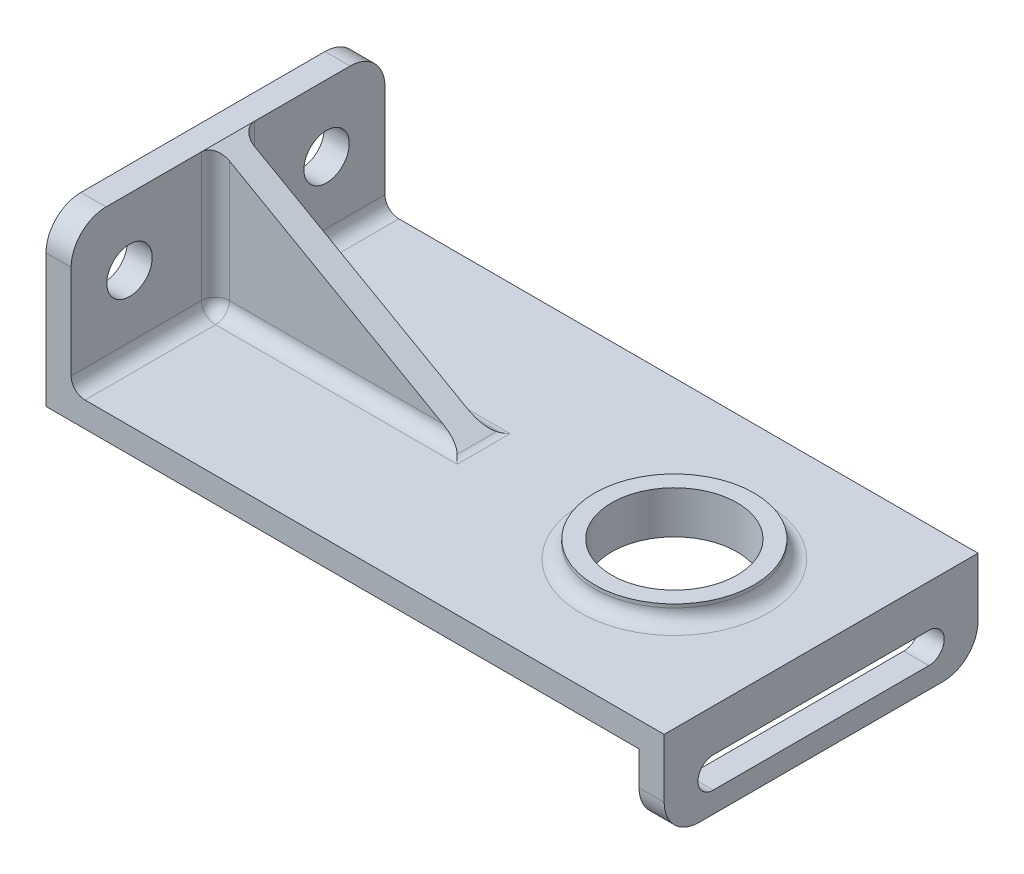
ISO-10303-21;
HEADER;
FILE_DESCRIPTION(('STEP AP214'),'2;1');
FILE_NAME('part.step','',(''),(''),'','','');
FILE_SCHEMA(('AUTOMOTIVE_DESIGN { 1 0 10303 214 1 1 1 1 }'));
ENDSEC;
DATA;
#1=APPLICATION_CONTEXT('core data for automotive mechanical design processes');
#2=APPLICATION_PROTOCOL_DEFINITION('international standard','automotive_design',2000,#1);
#3=PRODUCT_CONTEXT('',#1,'mechanical');
#4=PRODUCT('Part','Part','',(#3));
#5=PRODUCT_RELATED_PRODUCT_CATEGORY('part','',(#4));
#6=PRODUCT_DEFINITION_FORMATION('','',#4);
#7=PRODUCT_DEFINITION_CONTEXT('part definition',#1,'design');
#8=PRODUCT_DEFINITION('design','',#6,#7);
#9=PRODUCT_DEFINITION_SHAPE('','',#8);
#10=(LENGTH_UNIT() NAMED_UNIT(*) SI_UNIT(.MILLI.,.METRE.));
#11=(NAMED_UNIT(*) PLANE_ANGLE_UNIT() SI_UNIT($,.RADIAN.));
#12=(NAMED_UNIT(*) SI_UNIT($,.STERADIAN.) SOLID_ANGLE_UNIT());
#13=UNCERTAINTY_MEASURE_WITH_UNIT(LENGTH_MEASURE(1.E-05),#10,'distance_accuracy_value','');
#14=(GEOMETRIC_REPRESENTATION_CONTEXT(3) GLOBAL_UNCERTAINTY_ASSIGNED_CONTEXT((#13)) GLOBAL_UNIT_ASSIGNED_CONTEXT((#10,
#11,#12)) REPRESENTATION_CONTEXT('',''));
#15=CARTESIAN_POINT('',(0.,0.,0.));
#16=DIRECTION('',(0.,0.,1.));
#17=DIRECTION('',(1.,0.,0.));
#18=AXIS2_PLACEMENT_3D('',#15,#16,#17);
#19=CARTESIAN_POINT('',(4.572,30.5769704433498,57.15));
#20=DIRECTION('',(-1.,0.,0.));
#21=DIRECTION('',(0.,0.,1.));
#22=AXIS2_PLACEMENT_3D('',#19,#20,#21);
#23=PLANE('',#22);
#24=CARTESIAN_POINT('',(4.572,18.4320182001585,10.6369174101885));
#25=DIRECTION('',(1.,0.,0.));
#26=DIRECTION('',(0.,0.,1.));
#27=AXIS2_PLACEMENT_3D('',#24,#25,#26);
#28=CIRCLE('',#27,4.13408051592562);
#29=CARTESIAN_POINT('',(4.572,18.4320182001585,14.7709979261142));
#30=VERTEX_POINT('',#29);
#31=EDGE_CURVE('E556',#30,#30,#28,.T.);
#32=ORIENTED_EDGE('',*,*,#31,.F.);
#33=EDGE_LOOP('',(#32));
#34=FACE_BOUND('',#33,.T.);
#35=DIRECTION('',(0.,1.,0.));
#36=VECTOR('',#35,1.);
#37=CARTESIAN_POINT('',(4.572,30.5769704433498,0.));
#38=LINE('',#37,#36);
#39=CARTESIAN_POINT('',(4.572,7.112,0.));
#40=VERTEX_POINT('',#39);
#41=CARTESIAN_POINT('',(4.572,24.2269704433498,0.));
#42=VERTEX_POINT('',#41);
#43=EDGE_CURVE('E260',#40,#42,#38,.T.);
#44=ORIENTED_EDGE('',*,*,#43,.T.);
#45=CARTESIAN_POINT('',(4.572,24.2269704433498,6.35));
#46=DIRECTION('',(-1.,0.,0.));
#47=DIRECTION('',(0.,0.,1.));
#48=AXIS2_PLACEMENT_3D('',#45,#46,#47);
#49=CIRCLE('',#48,6.35);
#50=CARTESIAN_POINT('',(4.572,30.5769704433498,6.35));
#51=VERTEX_POINT('',#50);
#52=EDGE_CURVE('E39',#42,#51,#49,.F.);
#53=ORIENTED_EDGE('',*,*,#52,.T.);
#54=DIRECTION('',(0.,0.,-1.));
#55=VECTOR('',#54,1.);
#56=CARTESIAN_POINT('',(4.572,30.5769704433498,57.15));
#57=LINE('',#56,#55);
#58=CARTESIAN_POINT('',(4.572,30.5769704433498,23.749));
#59=VERTEX_POINT('',#58);
#60=EDGE_CURVE('E273',#59,#51,#57,.T.);
#61=ORIENTED_EDGE('',*,*,#60,.F.);
#62=DIRECTION('',(0.,-1.,0.));
#63=VECTOR('',#62,1.);
#64=CARTESIAN_POINT('',(4.572,4.572,23.749));
#65=LINE('',#64,#63);
#66=CARTESIAN_POINT('',(4.572,7.112,23.749));
#67=VERTEX_POINT('',#66);
#68=EDGE_CURVE('E313',#59,#67,#65,.T.);
#69=ORIENTED_EDGE('',*,*,#68,.T.);
#70=DIRECTION('',(0.,0.,-1.));
#71=VECTOR('',#70,1.);
#72=CARTESIAN_POINT('',(4.572,7.112,0.));
#73=LINE('',#72,#71);
#74=EDGE_CURVE('E315',#67,#40,#73,.T.);
#75=ORIENTED_EDGE('',*,*,#74,.T.);
#76=EDGE_LOOP('',(#44,#53,#61,#69,#75));
#77=FACE_BOUND('',#76,.T.);
#78=ADVANCED_FACE('F31',(#34,#77),#23,.F.);
#79=CARTESIAN_POINT('',(4.572,4.572,57.15));
#80=DIRECTION('',(0.,-1.,0.));
#81=DIRECTION('',(0.,0.,-1.));
#82=AXIS2_PLACEMENT_3D('',#79,#80,#81);
#83=PLANE('',#82);
#84=DIRECTION('',(-1.,0.,0.));
#85=VECTOR('',#84,1.);
#86=CARTESIAN_POINT('',(4.572,4.572,0.));
#87=LINE('',#86,#85);
#88=CARTESIAN_POINT('',(112.562032379476,4.572,0.));
#89=VERTEX_POINT('',#88);
#90=CARTESIAN_POINT('',(7.112,4.572,0.));
#91=VERTEX_POINT('',#90);
#92=EDGE_CURVE('E282',#89,#91,#87,.T.);
#93=ORIENTED_EDGE('',*,*,#92,.T.);
#94=DIRECTION('',(0.,0.,-1.));
#95=VECTOR('',#94,1.);
#96=CARTESIAN_POINT('',(7.112,4.572,26.289));
#97=LINE('',#96,#95);
#98=CARTESIAN_POINT('',(7.112,4.572,23.749));
#99=VERTEX_POINT('',#98);
#100=EDGE_CURVE('E326',#91,#99,#97,.F.);
#101=ORIENTED_EDGE('',*,*,#100,.T.);
#102=DIRECTION('',(1.,0.,0.));
#103=VECTOR('',#102,1.);
#104=CARTESIAN_POINT('',(50.4513053062079,4.572,23.749));
#105=LINE('',#104,#103);
#106=CARTESIAN_POINT('',(51.1211008800022,4.572,23.749));
#107=VERTEX_POINT('',#106);
#108=EDGE_CURVE('E322',#99,#107,#105,.T.);
#109=ORIENTED_EDGE('',*,*,#108,.T.);
#110=DIRECTION('',(0.,0.,-1.));
#111=VECTOR('',#110,1.);
#112=CARTESIAN_POINT('',(51.1211008800022,4.572,30.861));
#113=LINE('',#112,#111);
#114=CARTESIAN_POINT('',(51.1211008800022,4.572,33.401));
#115=VERTEX_POINT('',#114);
#116=EDGE_CURVE('E320',#107,#115,#113,.F.);
#117=ORIENTED_EDGE('',*,*,#116,.T.);
#118=DIRECTION('',(1.,0.,0.));
#119=VECTOR('',#118,1.);
#120=CARTESIAN_POINT('',(4.572,4.572,33.401));
#121=LINE('',#120,#119);
#122=CARTESIAN_POINT('',(7.112,4.572,33.401));
#123=VERTEX_POINT('',#122);
#124=EDGE_CURVE('E318',#115,#123,#121,.F.);
#125=ORIENTED_EDGE('',*,*,#124,.T.);
#126=DIRECTION('',(0.,0.,-1.));
#127=VECTOR('',#126,1.);
#128=CARTESIAN_POINT('',(7.112,4.572,57.15));
#129=LINE('',#128,#127);
#130=CARTESIAN_POINT('',(7.112,4.572,57.15));
#131=VERTEX_POINT('',#130);
#132=EDGE_CURVE('E324',#123,#131,#129,.F.);
#133=ORIENTED_EDGE('',*,*,#132,.T.);
#134=DIRECTION('',(-1.,0.,0.));
#135=VECTOR('',#134,1.);
#136=CARTESIAN_POINT('',(4.572,4.572,57.15));
#137=LINE('',#136,#135);
#138=CARTESIAN_POINT('',(112.562032379476,4.572,57.15));
#139=VERTEX_POINT('',#138);
#140=EDGE_CURVE('E267',#139,#131,#137,.T.);
#141=ORIENTED_EDGE('',*,*,#140,.F.);
#142=DIRECTION('',(0.,0.,-1.));
#143=VECTOR('',#142,1.);
#144=CARTESIAN_POINT('',(112.562032379476,4.572,57.15));
#145=LINE('',#144,#143);
#146=EDGE_CURVE('E289',#139,#89,#145,.T.);
#147=ORIENTED_EDGE('',*,*,#146,.T.);
#148=EDGE_LOOP('',(#93,#101,#109,#117,#125,#133,#141,#147));
#149=FACE_BOUND('',#148,.T.);
#150=CARTESIAN_POINT('',(85.8466273348881,4.572,28.575));
#151=DIRECTION('',(0.,-1.,0.));
#152=DIRECTION('',(0.,0.,-1.));
#153=AXIS2_PLACEMENT_3D('',#150,#151,#152);
#154=CIRCLE('',#153,17.0464140193085);
#155=CARTESIAN_POINT('',(85.8466273348881,4.572,11.5285859806915));
#156=VERTEX_POINT('',#155);
#157=EDGE_CURVE('E310',#156,#156,#154,.T.);
#158=ORIENTED_EDGE('',*,*,#157,.T.);
#159=EDGE_LOOP('',(#158));
#160=FACE_BOUND('',#159,.T.);
#161=ADVANCED_FACE('F460',(#149,#160),#83,.F.);
#162=CARTESIAN_POINT('',(0.,30.5769704433498,57.15));
#163=DIRECTION('',(0.,-1.,0.));
#164=DIRECTION('',(0.,0.,-1.));
#165=AXIS2_PLACEMENT_3D('',#162,#163,#164);
#166=PLANE('',#165);
#167=ORIENTED_EDGE('',*,*,#60,.T.);
#168=DIRECTION('',(-1.,0.,0.));
#169=VECTOR('',#168,1.);
#170=CARTESIAN_POINT('',(0.,30.5769704433498,6.35));
#171=LINE('',#170,#169);
#172=CARTESIAN_POINT('',(0.,30.5769704433498,6.35));
#173=VERTEX_POINT('',#172);
#174=EDGE_CURVE('E404',#51,#173,#171,.T.);
#175=ORIENTED_EDGE('',*,*,#174,.T.);
#176=DIRECTION('',(0.,0.,-1.));
#177=VECTOR('',#176,1.);
#178=CARTESIAN_POINT('',(0.,30.5769704433498,57.15));
#179=LINE('',#178,#177);
#180=CARTESIAN_POINT('',(0.,30.5769704433498,50.8));
#181=VERTEX_POINT('',#180);
#182=EDGE_CURVE('E304',#181,#173,#179,.T.);
#183=ORIENTED_EDGE('',*,*,#182,.F.);
#184=DIRECTION('',(-1.,0.,0.));
#185=VECTOR('',#184,1.);
#186=CARTESIAN_POINT('',(0.,30.5769704433498,50.8));
#187=LINE('',#186,#185);
#188=CARTESIAN_POINT('',(4.572,30.5769704433498,50.8));
#189=VERTEX_POINT('',#188);
#190=EDGE_CURVE('E402',#181,#189,#187,.F.);
#191=ORIENTED_EDGE('',*,*,#190,.T.);
#192=CARTESIAN_POINT('',(4.572,30.5769704433498,33.401));
#193=VERTEX_POINT('',#192);
#194=EDGE_CURVE('E287',#189,#193,#57,.T.);
#195=ORIENTED_EDGE('',*,*,#194,.T.);
#196=DIRECTION('',(0.,0.,-1.));
#197=VECTOR('',#196,1.);
#198=CARTESIAN_POINT('',(4.572,30.5769704433498,30.861));
#199=LINE('',#198,#197);
#200=EDGE_CURVE('E241',#193,#59,#199,.T.);
#201=ORIENTED_EDGE('',*,*,#200,.T.);
#202=EDGE_LOOP('',(#167,#175,#183,#191,#195,#201));
#203=FACE_BOUND('',#202,.T.);
#204=ADVANCED_FACE('F419',(#203),#166,.F.);
#205=CARTESIAN_POINT('',(0.,30.5769704433498,57.15));
#206=DIRECTION('',(1.,0.,0.));
#207=DIRECTION('',(0.,0.,-1.));
#208=AXIS2_PLACEMENT_3D('',#205,#206,#207);
#209=PLANE('',#208);
#210=CARTESIAN_POINT('',(0.,18.4320182001585,10.6369174101885));
#211=DIRECTION('',(1.,0.,0.));
#212=DIRECTION('',(0.,0.,1.));
#213=AXIS2_PLACEMENT_3D('',#210,#211,#212);
#214=CIRCLE('',#213,4.13408051592562);
#215=CARTESIAN_POINT('',(0.,18.4320182001585,14.7709979261142));
#216=VERTEX_POINT('',#215);
#217=EDGE_CURVE('E553',#216,#216,#214,.T.);
#218=ORIENTED_EDGE('',*,*,#217,.T.);
#219=EDGE_LOOP('',(#218));
#220=FACE_BOUND('',#219,.T.);
#221=CARTESIAN_POINT('',(0.,18.4320182001585,46.5130825898115));
#222=DIRECTION('',(1.,0.,0.));
#223=DIRECTION('',(0.,0.,-1.));
#224=AXIS2_PLACEMENT_3D('',#221,#222,#223);
#225=CIRCLE('',#224,4.13408051592562);
#226=CARTESIAN_POINT('',(0.,18.4320182001585,42.3790020738858));
#227=VERTEX_POINT('',#226);
#228=EDGE_CURVE('E228',#227,#227,#225,.T.);
#229=ORIENTED_EDGE('',*,*,#228,.T.);
#230=EDGE_LOOP('',(#229));
#231=FACE_BOUND('',#230,.T.);
#232=ORIENTED_EDGE('',*,*,#182,.T.);
#233=CARTESIAN_POINT('',(0.,24.2269704433498,6.35));
#234=DIRECTION('',(1.,0.,0.));
#235=DIRECTION('',(0.,0.,-1.));
#236=AXIS2_PLACEMENT_3D('',#233,#234,#235);
#237=CIRCLE('',#236,6.35);
#238=CARTESIAN_POINT('',(0.,24.2269704433498,0.));
#239=VERTEX_POINT('',#238);
#240=EDGE_CURVE('E409',#173,#239,#237,.F.);
#241=ORIENTED_EDGE('',*,*,#240,.T.);
#242=DIRECTION('',(0.,-1.,0.));
#243=VECTOR('',#242,1.);
#244=CARTESIAN_POINT('',(0.,30.5769704433498,0.));
#245=LINE('',#244,#243);
#246=CARTESIAN_POINT('',(0.,0.,0.));
#247=VERTEX_POINT('',#246);
#248=EDGE_CURVE('E256',#239,#247,#245,.T.);
#249=ORIENTED_EDGE('',*,*,#248,.T.);
#250=DIRECTION('',(0.,0.,-1.));
#251=VECTOR('',#250,1.);
#252=CARTESIAN_POINT('',(0.,0.,57.15));
#253=LINE('',#252,#251);
#254=CARTESIAN_POINT('',(0.,0.,57.15));
#255=VERTEX_POINT('',#254);
#256=EDGE_CURVE('E301',#255,#247,#253,.T.);
#257=ORIENTED_EDGE('',*,*,#256,.F.);
#258=DIRECTION('',(0.,-1.,0.));
#259=VECTOR('',#258,1.);
#260=CARTESIAN_POINT('',(0.,30.5769704433498,57.15));
#261=LINE('',#260,#259);
#262=CARTESIAN_POINT('',(0.,24.2269704433498,57.15));
#263=VERTEX_POINT('',#262);
#264=EDGE_CURVE('E257',#263,#255,#261,.T.);
#265=ORIENTED_EDGE('',*,*,#264,.F.);
#266=CARTESIAN_POINT('',(0.,24.2269704433498,50.8));
#267=DIRECTION('',(1.,0.,0.));
#268=DIRECTION('',(0.,0.,-1.));
#269=AXIS2_PLACEMENT_3D('',#266,#267,#268);
#270=CIRCLE('',#269,6.35);
#271=EDGE_CURVE('E407',#263,#181,#270,.F.);
#272=ORIENTED_EDGE('',*,*,#271,.T.);
#273=EDGE_LOOP('',(#232,#241,#249,#257,#265,#272));
#274=FACE_BOUND('',#273,.T.);
#275=ADVANCED_FACE('F425',(#220,#231,#274),#209,.F.);
#276=CARTESIAN_POINT('',(0.,0.,57.15));
#277=DIRECTION('',(0.,1.,0.));
#278=DIRECTION('',(0.,0.,1.));
#279=AXIS2_PLACEMENT_3D('',#276,#277,#278);
#280=PLANE('',#279);
#281=CARTESIAN_POINT('',(85.8466273348881,0.,28.575));
#282=DIRECTION('',(0.,1.,0.));
#283=DIRECTION('',(0.,0.,1.));
#284=AXIS2_PLACEMENT_3D('',#281,#282,#283);
#285=CIRCLE('',#284,11.4214455987884);
#286=CARTESIAN_POINT('',(85.8466273348881,0.,39.9964455987884));
#287=VERTEX_POINT('',#286);
#288=EDGE_CURVE('E250',#287,#287,#285,.T.);
#289=ORIENTED_EDGE('',*,*,#288,.T.);
#290=EDGE_LOOP('',(#289));
#291=FACE_BOUND('',#290,.T.);
#292=DIRECTION('',(1.,0.,0.));
#293=VECTOR('',#292,1.);
#294=CARTESIAN_POINT('',(0.,0.,0.));
#295=LINE('',#294,#293);
#296=CARTESIAN_POINT('',(107.990032379476,0.,0.));
#297=VERTEX_POINT('',#296);
#298=EDGE_CURVE('E275',#247,#297,#295,.T.);
#299=ORIENTED_EDGE('',*,*,#298,.T.);
#300=DIRECTION('',(0.,0.,-1.));
#301=VECTOR('',#300,1.);
#302=CARTESIAN_POINT('',(107.990032379476,0.,57.15));
#303=LINE('',#302,#301);
#304=CARTESIAN_POINT('',(107.990032379476,0.,57.15));
#305=VERTEX_POINT('',#304);
#306=EDGE_CURVE('E298',#305,#297,#303,.T.);
#307=ORIENTED_EDGE('',*,*,#306,.F.);
#308=DIRECTION('',(1.,0.,0.));
#309=VECTOR('',#308,1.);
#310=CARTESIAN_POINT('',(0.,0.,57.15));
#311=LINE('',#310,#309);
#312=EDGE_CURVE('E259',#255,#305,#311,.T.);
#313=ORIENTED_EDGE('',*,*,#312,.F.);
#314=ORIENTED_EDGE('',*,*,#256,.T.);
#315=EDGE_LOOP('',(#299,#307,#313,#314));
#316=FACE_BOUND('',#315,.T.);
#317=ADVANCED_FACE('F434',(#291,#316),#280,.F.);
#318=CARTESIAN_POINT('',(107.990032379476,0.,57.15));
#319=DIRECTION('',(1.,0.,0.));
#320=DIRECTION('',(0.,0.,-1.));
#321=AXIS2_PLACEMENT_3D('',#318,#319,#320);
#322=PLANE('',#321);
#323=DIRECTION('',(0.,0.,1.));
#324=VECTOR('',#323,1.);
#325=CARTESIAN_POINT('',(107.990032379476,-3.12997114485115,48.2161771103619));
#326=LINE('',#325,#324);
#327=CARTESIAN_POINT('',(107.990032379476,-3.12997114485114,8.93382288963807));
#328=VERTEX_POINT('',#327);
#329=CARTESIAN_POINT('',(107.990032379476,-3.12997114485115,48.2161771103619));
#330=VERTEX_POINT('',#329);
#331=EDGE_CURVE('E205',#328,#330,#326,.T.);
#332=ORIENTED_EDGE('',*,*,#331,.T.);
#333=CARTESIAN_POINT('',(107.990032379476,-5.90657363611414,48.2161771103619));
#334=DIRECTION('',(1.,0.,0.));
#335=DIRECTION('',(0.,0.,-1.));
#336=AXIS2_PLACEMENT_3D('',#333,#334,#335);
#337=CIRCLE('',#336,2.77660249126299);
#338=CARTESIAN_POINT('',(107.990032379476,-8.68317612737713,48.2161771103619));
#339=VERTEX_POINT('',#338);
#340=EDGE_CURVE('E199',#330,#339,#337,.T.);
#341=ORIENTED_EDGE('',*,*,#340,.T.);
#342=DIRECTION('',(0.,0.,-1.));
#343=VECTOR('',#342,1.);
#344=CARTESIAN_POINT('',(107.990032379476,-8.68317612737713,48.2161771103619));
#345=LINE('',#344,#343);
#346=CARTESIAN_POINT('',(107.990032379476,-8.68317612737712,8.93382288963807));
#347=VERTEX_POINT('',#346);
#348=EDGE_CURVE('E208',#339,#347,#345,.T.);
#349=ORIENTED_EDGE('',*,*,#348,.T.);
#350=CARTESIAN_POINT('',(107.990032379476,-5.90657363611413,8.93382288963807));
#351=DIRECTION('',(1.,0.,0.));
#352=DIRECTION('',(0.,0.,-1.));
#353=AXIS2_PLACEMENT_3D('',#350,#351,#352);
#354=CIRCLE('',#353,2.77660249126299);
#355=EDGE_CURVE('E46',#347,#328,#354,.T.);
#356=ORIENTED_EDGE('',*,*,#355,.T.);
#357=EDGE_LOOP('',(#332,#341,#349,#356));
#358=FACE_BOUND('',#357,.T.);
#359=DIRECTION('',(0.,-1.,0.));
#360=VECTOR('',#359,1.);
#361=CARTESIAN_POINT('',(107.990032379476,0.,0.));
#362=LINE('',#361,#360);
#363=CARTESIAN_POINT('',(107.990032379476,-6.14667487684729,0.));
#364=VERTEX_POINT('',#363);
#365=EDGE_CURVE('E277',#297,#364,#362,.T.);
#366=ORIENTED_EDGE('',*,*,#365,.T.);
#367=CARTESIAN_POINT('',(107.990032379476,-6.14667487684729,6.35));
#368=DIRECTION('',(1.,0.,0.));
#369=DIRECTION('',(0.,0.,-1.));
#370=AXIS2_PLACEMENT_3D('',#367,#368,#369);
#371=CIRCLE('',#370,6.35);
#372=CARTESIAN_POINT('',(107.990032379476,-12.4966748768473,6.35));
#373=VERTEX_POINT('',#372);
#374=EDGE_CURVE('E394',#364,#373,#371,.F.);
#375=ORIENTED_EDGE('',*,*,#374,.T.);
#376=DIRECTION('',(0.,0.,-1.));
#377=VECTOR('',#376,1.);
#378=CARTESIAN_POINT('',(107.990032379476,-12.4966748768473,57.15));
#379=LINE('',#378,#377);
#380=CARTESIAN_POINT('',(107.990032379476,-12.4966748768473,50.8));
#381=VERTEX_POINT('',#380);
#382=EDGE_CURVE('E295',#381,#373,#379,.T.);
#383=ORIENTED_EDGE('',*,*,#382,.F.);
#384=CARTESIAN_POINT('',(107.990032379476,-6.14667487684729,50.8));
#385=DIRECTION('',(1.,0.,0.));
#386=DIRECTION('',(0.,0.,-1.));
#387=AXIS2_PLACEMENT_3D('',#384,#385,#386);
#388=CIRCLE('',#387,6.35);
#389=CARTESIAN_POINT('',(107.990032379476,-6.14667487684729,57.15));
#390=VERTEX_POINT('',#389);
#391=EDGE_CURVE('E392',#381,#390,#388,.F.);
#392=ORIENTED_EDGE('',*,*,#391,.T.);
#393=DIRECTION('',(0.,-1.,0.));
#394=VECTOR('',#393,1.);
#395=CARTESIAN_POINT('',(107.990032379476,0.,57.15));
#396=LINE('',#395,#394);
#397=EDGE_CURVE('E262',#305,#390,#396,.T.);
#398=ORIENTED_EDGE('',*,*,#397,.F.);
#399=ORIENTED_EDGE('',*,*,#306,.T.);
#400=EDGE_LOOP('',(#366,#375,#383,#392,#398,#399));
#401=FACE_BOUND('',#400,.T.);
#402=ADVANCED_FACE('F212',(#358,#401),#322,.F.);
#403=CARTESIAN_POINT('',(107.990032379476,-12.4966748768473,57.15));
#404=DIRECTION('',(0.,1.,0.));
#405=DIRECTION('',(0.,0.,1.));
#406=AXIS2_PLACEMENT_3D('',#403,#404,#405);
#407=PLANE('',#406);
#408=ORIENTED_EDGE('',*,*,#382,.T.);
#409=DIRECTION('',(1.,0.,0.));
#410=VECTOR('',#409,1.);
#411=CARTESIAN_POINT('',(112.562032379476,-12.4966748768473,6.35));
#412=LINE('',#411,#410);
#413=CARTESIAN_POINT('',(112.562032379476,-12.4966748768473,6.35));
#414=VERTEX_POINT('',#413);
#415=EDGE_CURVE('E381',#373,#414,#412,.T.);
#416=ORIENTED_EDGE('',*,*,#415,.T.);
#417=DIRECTION('',(0.,0.,-1.));
#418=VECTOR('',#417,1.);
#419=CARTESIAN_POINT('',(112.562032379476,-12.4966748768473,57.15));
#420=LINE('',#419,#418);
#421=CARTESIAN_POINT('',(112.562032379476,-12.4966748768473,50.8));
#422=VERTEX_POINT('',#421);
#423=EDGE_CURVE('E292',#422,#414,#420,.T.);
#424=ORIENTED_EDGE('',*,*,#423,.F.);
#425=DIRECTION('',(1.,0.,0.));
#426=VECTOR('',#425,1.);
#427=CARTESIAN_POINT('',(107.990032379476,-12.4966748768473,50.8));
#428=LINE('',#427,#426);
#429=EDGE_CURVE('E357',#422,#381,#428,.F.);
#430=ORIENTED_EDGE('',*,*,#429,.T.);
#431=EDGE_LOOP('',(#408,#416,#424,#430));
#432=FACE_BOUND('',#431,.T.);
#433=ADVANCED_FACE('F452',(#432),#407,.F.);
#434=CARTESIAN_POINT('',(112.562032379476,4.572,57.15));
#435=DIRECTION('',(-1.,0.,0.));
#436=DIRECTION('',(0.,0.,1.));
#437=AXIS2_PLACEMENT_3D('',#434,#435,#436);
#438=PLANE('',#437);
#439=DIRECTION('',(0.,0.,-1.));
#440=VECTOR('',#439,1.);
#441=CARTESIAN_POINT('',(112.562032379476,-8.68317612737713,48.2161771103619));
#442=LINE('',#441,#440);
#443=CARTESIAN_POINT('',(112.562032379476,-8.68317612737713,48.2161771103619));
#444=VERTEX_POINT('',#443);
#445=CARTESIAN_POINT('',(112.562032379476,-8.68317612737712,8.93382288963807));
#446=VERTEX_POINT('',#445);
#447=EDGE_CURVE('E227',#444,#446,#442,.T.);
#448=ORIENTED_EDGE('',*,*,#447,.F.);
#449=CARTESIAN_POINT('',(112.562032379476,-5.90657363611414,48.2161771103619));
#450=DIRECTION('',(1.,0.,0.));
#451=DIRECTION('',(0.,0.,-1.));
#452=AXIS2_PLACEMENT_3D('',#449,#450,#451);
#453=CIRCLE('',#452,2.77660249126299);
#454=CARTESIAN_POINT('',(112.562032379476,-3.12997114485115,48.2161771103619));
#455=VERTEX_POINT('',#454);
#456=EDGE_CURVE('E54',#455,#444,#453,.T.);
#457=ORIENTED_EDGE('',*,*,#456,.F.);
#458=DIRECTION('',(0.,0.,1.));
#459=VECTOR('',#458,1.);
#460=CARTESIAN_POINT('',(112.562032379476,-3.12997114485115,48.2161771103619));
#461=LINE('',#460,#459);
#462=CARTESIAN_POINT('',(112.562032379476,-3.12997114485114,8.93382288963807));
#463=VERTEX_POINT('',#462);
#464=EDGE_CURVE('E215',#463,#455,#461,.T.);
#465=ORIENTED_EDGE('',*,*,#464,.F.);
#466=CARTESIAN_POINT('',(112.562032379476,-5.90657363611413,8.93382288963807));
#467=DIRECTION('',(1.,0.,0.));
#468=DIRECTION('',(0.,0.,-1.));
#469=AXIS2_PLACEMENT_3D('',#466,#467,#468);
#470=CIRCLE('',#469,2.77660249126299);
#471=EDGE_CURVE('E218',#446,#463,#470,.T.);
#472=ORIENTED_EDGE('',*,*,#471,.F.);
#473=EDGE_LOOP('',(#448,#457,#465,#472));
#474=FACE_BOUND('',#473,.T.);
#475=ORIENTED_EDGE('',*,*,#423,.T.);
#476=CARTESIAN_POINT('',(112.562032379476,-6.14667487684729,6.35));
#477=DIRECTION('',(-1.,0.,0.));
#478=DIRECTION('',(0.,0.,1.));
#479=AXIS2_PLACEMENT_3D('',#476,#477,#478);
#480=CIRCLE('',#479,6.35);
#481=CARTESIAN_POINT('',(112.562032379476,-6.14667487684729,0.));
#482=VERTEX_POINT('',#481);
#483=EDGE_CURVE('E386',#414,#482,#480,.F.);
#484=ORIENTED_EDGE('',*,*,#483,.T.);
#485=DIRECTION('',(0.,1.,0.));
#486=VECTOR('',#485,1.);
#487=CARTESIAN_POINT('',(112.562032379476,4.572,0.));
#488=LINE('',#487,#486);
#489=EDGE_CURVE('E280',#482,#89,#488,.T.);
#490=ORIENTED_EDGE('',*,*,#489,.T.);
#491=ORIENTED_EDGE('',*,*,#146,.F.);
#492=DIRECTION('',(0.,1.,0.));
#493=VECTOR('',#492,1.);
#494=CARTESIAN_POINT('',(112.562032379476,4.572,57.15));
#495=LINE('',#494,#493);
#496=CARTESIAN_POINT('',(112.562032379476,-6.14667487684728,57.15));
#497=VERTEX_POINT('',#496);
#498=EDGE_CURVE('E265',#497,#139,#495,.T.);
#499=ORIENTED_EDGE('',*,*,#498,.F.);
#500=CARTESIAN_POINT('',(112.562032379476,-6.14667487684729,50.8));
#501=DIRECTION('',(-1.,0.,0.));
#502=DIRECTION('',(0.,0.,1.));
#503=AXIS2_PLACEMENT_3D('',#500,#501,#502);
#504=CIRCLE('',#503,6.35);
#505=EDGE_CURVE('E384',#497,#422,#504,.F.);
#506=ORIENTED_EDGE('',*,*,#505,.T.);
#507=EDGE_LOOP('',(#475,#484,#490,#491,#499,#506));
#508=FACE_BOUND('',#507,.T.);
#509=ADVANCED_FACE('F449',(#474,#508),#438,.F.);
#510=CARTESIAN_POINT('',(4.572,18.4320182001585,46.5130825898115));
#511=DIRECTION('',(1.,0.,0.));
#512=DIRECTION('',(0.,0.,-1.));
#513=AXIS2_PLACEMENT_3D('',#510,#511,#512);
#514=CIRCLE('',#513,4.13408051592562);
#515=CARTESIAN_POINT('',(4.572,18.4320182001585,42.3790020738858));
#516=VERTEX_POINT('',#515);
#517=EDGE_CURVE('E221',#516,#516,#514,.T.);
#518=ORIENTED_EDGE('',*,*,#517,.F.);
#519=EDGE_LOOP('',(#518));
#520=FACE_BOUND('',#519,.T.);
#521=ORIENTED_EDGE('',*,*,#194,.F.);
#522=CARTESIAN_POINT('',(4.572,24.2269704433498,50.8));
#523=DIRECTION('',(-1.,0.,0.));
#524=DIRECTION('',(0.,0.,1.));
#525=AXIS2_PLACEMENT_3D('',#522,#523,#524);
#526=CIRCLE('',#525,6.35);
#527=CARTESIAN_POINT('',(4.572,24.2269704433498,57.15));
#528=VERTEX_POINT('',#527);
#529=EDGE_CURVE('E11',#189,#528,#526,.F.);
#530=ORIENTED_EDGE('',*,*,#529,.T.);
#531=DIRECTION('',(0.,1.,0.));
#532=VECTOR('',#531,1.);
#533=CARTESIAN_POINT('',(4.572,30.5769704433498,57.15));
#534=LINE('',#533,#532);
#535=CARTESIAN_POINT('',(4.572,7.112,57.15));
#536=VERTEX_POINT('',#535);
#537=EDGE_CURVE('E270',#536,#528,#534,.T.);
#538=ORIENTED_EDGE('',*,*,#537,.F.);
#539=DIRECTION('',(0.,0.,-1.));
#540=VECTOR('',#539,1.);
#541=CARTESIAN_POINT('',(4.572,7.112,30.861));
#542=LINE('',#541,#540);
#543=CARTESIAN_POINT('',(4.572,7.112,33.401));
#544=VERTEX_POINT('',#543);
#545=EDGE_CURVE('E331',#536,#544,#542,.T.);
#546=ORIENTED_EDGE('',*,*,#545,.T.);
#547=DIRECTION('',(0.,-1.,0.));
#548=VECTOR('',#547,1.);
#549=CARTESIAN_POINT('',(4.572,30.5769704433498,33.401));
#550=LINE('',#549,#548);
#551=EDGE_CURVE('E328',#544,#193,#550,.F.);
#552=ORIENTED_EDGE('',*,*,#551,.T.);
#553=EDGE_LOOP('',(#521,#530,#538,#546,#552));
#554=FACE_BOUND('',#553,.T.);
#555=ADVANCED_FACE('F503',(#520,#554),#23,.F.);
#556=CARTESIAN_POINT('',(4.572,30.5769704433498,57.15));
#557=DIRECTION('',(0.,0.,-1.));
#558=DIRECTION('',(-1.,0.,0.));
#559=AXIS2_PLACEMENT_3D('',#556,#557,#558);
#560=PLANE('',#559);
#561=ORIENTED_EDGE('',*,*,#397,.T.);
#562=DIRECTION('',(1.,0.,0.));
#563=VECTOR('',#562,1.);
#564=CARTESIAN_POINT('',(4.572,-6.14667487684729,57.15));
#565=LINE('',#564,#563);
#566=EDGE_CURVE('E399',#390,#497,#565,.T.);
#567=ORIENTED_EDGE('',*,*,#566,.T.);
#568=ORIENTED_EDGE('',*,*,#498,.T.);
#569=ORIENTED_EDGE('',*,*,#140,.T.);
#570=CARTESIAN_POINT('',(7.112,7.112,57.15));
#571=DIRECTION('',(0.,0.,-1.));
#572=DIRECTION('',(-1.,0.,0.));
#573=AXIS2_PLACEMENT_3D('',#570,#571,#572);
#574=CIRCLE('',#573,2.54);
#575=EDGE_CURVE('E345',#131,#536,#574,.T.);
#576=ORIENTED_EDGE('',*,*,#575,.T.);
#577=ORIENTED_EDGE('',*,*,#537,.T.);
#578=DIRECTION('',(-1.,0.,0.));
#579=VECTOR('',#578,1.);
#580=CARTESIAN_POINT('',(4.572,24.2269704433498,57.15));
#581=LINE('',#580,#579);
#582=EDGE_CURVE('E396',#528,#263,#581,.T.);
#583=ORIENTED_EDGE('',*,*,#582,.T.);
#584=ORIENTED_EDGE('',*,*,#264,.T.);
#585=ORIENTED_EDGE('',*,*,#312,.T.);
#586=EDGE_LOOP('',(#561,#567,#568,#569,#576,#577,#583,#584,#585));
#587=FACE_BOUND('',#586,.T.);
#588=ADVANCED_FACE('F442',(#587),#560,.F.);
#589=CARTESIAN_POINT('',(4.572,30.5769704433498,0.));
#590=DIRECTION('',(0.,0.,-1.));
#591=DIRECTION('',(-1.,0.,0.));
#592=AXIS2_PLACEMENT_3D('',#589,#590,#591);
#593=PLANE('',#592);
#594=ORIENTED_EDGE('',*,*,#489,.F.);
#595=DIRECTION('',(1.,0.,0.));
#596=VECTOR('',#595,1.);
#597=CARTESIAN_POINT('',(107.990032379476,-6.14667487684729,0.));
#598=LINE('',#597,#596);
#599=EDGE_CURVE('E390',#482,#364,#598,.F.);
#600=ORIENTED_EDGE('',*,*,#599,.T.);
#601=ORIENTED_EDGE('',*,*,#365,.F.);
#602=ORIENTED_EDGE('',*,*,#298,.F.);
#603=ORIENTED_EDGE('',*,*,#248,.F.);
#604=DIRECTION('',(-1.,0.,0.));
#605=VECTOR('',#604,1.);
#606=CARTESIAN_POINT('',(4.572,24.2269704433498,0.));
#607=LINE('',#606,#605);
#608=EDGE_CURVE('E388',#239,#42,#607,.F.);
#609=ORIENTED_EDGE('',*,*,#608,.T.);
#610=ORIENTED_EDGE('',*,*,#43,.F.);
#611=CARTESIAN_POINT('',(7.112,7.112,0.));
#612=DIRECTION('',(0.,0.,-1.));
#613=DIRECTION('',(-1.,0.,0.));
#614=AXIS2_PLACEMENT_3D('',#611,#612,#613);
#615=CIRCLE('',#614,2.54);
#616=EDGE_CURVE('E343',#40,#91,#615,.F.);
#617=ORIENTED_EDGE('',*,*,#616,.T.);
#618=ORIENTED_EDGE('',*,*,#92,.F.);
#619=EDGE_LOOP('',(#594,#600,#601,#602,#603,#609,#610,#617,#618));
#620=FACE_BOUND('',#619,.T.);
#621=ADVANCED_FACE('F430',(#620),#593,.T.);
#622=CARTESIAN_POINT('',(85.8466273348881,7.747,28.575));
#623=DIRECTION('',(0.,-1.,0.));
#624=DIRECTION('',(0.,0.,-1.));
#625=AXIS2_PLACEMENT_3D('',#622,#623,#624);
#626=CYLINDRICAL_SURFACE('',#625,14.5064140193085);
#627=CARTESIAN_POINT('',(85.8466273348881,7.112,28.575));
#628=DIRECTION('',(0.,-1.,0.));
#629=DIRECTION('',(0.,0.,-1.));
#630=AXIS2_PLACEMENT_3D('',#627,#628,#629);
#631=CIRCLE('',#630,14.5064140193085);
#632=CARTESIAN_POINT('',(85.8466273348881,7.112,14.0685859806915));
#633=VERTEX_POINT('',#632);
#634=EDGE_CURVE('E307',#633,#633,#631,.F.);
#635=ORIENTED_EDGE('',*,*,#634,.T.);
#636=EDGE_LOOP('',(#635));
#637=FACE_BOUND('',#636,.T.);
#638=CARTESIAN_POINT('',(85.8466273348881,7.747,28.575));
#639=DIRECTION('',(0.,1.,0.));
#640=DIRECTION('',(0.,0.,1.));
#641=AXIS2_PLACEMENT_3D('',#638,#639,#640);
#642=CIRCLE('',#641,14.5064140193085);
#643=CARTESIAN_POINT('',(85.8466273348881,7.747,43.0814140193085));
#644=VERTEX_POINT('',#643);
#645=EDGE_CURVE('E253',#644,#644,#642,.T.);
#646=ORIENTED_EDGE('',*,*,#645,.F.);
#647=EDGE_LOOP('',(#646));
#648=FACE_BOUND('',#647,.T.);
#649=ADVANCED_FACE('F706',(#637,#648),#626,.T.);
#650=CARTESIAN_POINT('',(85.8466273348881,7.747,28.575));
#651=DIRECTION('',(0.,1.,0.));
#652=DIRECTION('',(0.,0.,1.));
#653=AXIS2_PLACEMENT_3D('',#650,#651,#652);
#654=PLANE('',#653);
#655=CARTESIAN_POINT('',(85.8466273348881,7.747,28.575));
#656=DIRECTION('',(0.,1.,0.));
#657=DIRECTION('',(0.,0.,1.));
#658=AXIS2_PLACEMENT_3D('',#655,#656,#657);
#659=CIRCLE('',#658,11.4214455987884);
#660=CARTESIAN_POINT('',(85.8466273348881,7.747,39.9964455987884));
#661=VERTEX_POINT('',#660);
#662=EDGE_CURVE('E247',#661,#661,#659,.T.);
#663=ORIENTED_EDGE('',*,*,#662,.F.);
#664=EDGE_LOOP('',(#663));
#665=FACE_BOUND('',#664,.T.);
#666=ORIENTED_EDGE('',*,*,#645,.T.);
#667=EDGE_LOOP('',(#666));
#668=FACE_BOUND('',#667,.T.);
#669=ADVANCED_FACE('F617',(#665,#668),#654,.T.);
#670=CARTESIAN_POINT('',(85.8466273348881,7.112,28.575));
#671=DIRECTION('',(0.,-1.,0.));
#672=DIRECTION('',(0.,0.,-1.));
#673=AXIS2_PLACEMENT_3D('',#670,#671,#672);
#674=TOROIDAL_SURFACE('',#673,17.0464140193085,2.54);
#675=ORIENTED_EDGE('',*,*,#157,.F.);
#676=EDGE_LOOP('',(#675));
#677=FACE_BOUND('',#676,.T.);
#678=ORIENTED_EDGE('',*,*,#634,.F.);
#679=EDGE_LOOP('',(#678));
#680=FACE_BOUND('',#679,.T.);
#681=ADVANCED_FACE('F613',(#677,#680),#674,.F.);
#682=CARTESIAN_POINT('',(85.8466273348881,-8.128,28.575));
#683=DIRECTION('',(0.,1.,0.));
#684=DIRECTION('',(0.,0.,1.));
#685=AXIS2_PLACEMENT_3D('',#682,#683,#684);
#686=CYLINDRICAL_SURFACE('',#685,11.4214455987884);
#687=ORIENTED_EDGE('',*,*,#662,.T.);
#688=EDGE_LOOP('',(#687));
#689=FACE_BOUND('',#688,.T.);
#690=ORIENTED_EDGE('',*,*,#288,.F.);
#691=EDGE_LOOP('',(#690));
#692=FACE_BOUND('',#691,.T.);
#693=ADVANCED_FACE('F616',(#689,#692),#686,.F.);
#694=CARTESIAN_POINT('',(4.572,30.5769704433498,30.861));
#695=DIRECTION('',(-0.493108698222438,-0.869967707295721,0.));
#696=DIRECTION('',(0.86996770729572,-0.493108698222438,0.));
#697=AXIS2_PLACEMENT_3D('',#694,#695,#696);
#698=PLANE('',#697);
#699=DIRECTION('',(-0.869967707295721,0.493108698222438,0.));
#700=VECTOR('',#699,1.);
#701=CARTESIAN_POINT('',(4.572,30.5769704433498,30.861));
#702=LINE('',#701,#700);
#703=CARTESIAN_POINT('',(45.9701067702731,7.112,30.861));
#704=VERTEX_POINT('',#703);
#705=CARTESIAN_POINT('',(7.112,29.1372663221723,30.861));
#706=VERTEX_POINT('',#705);
#707=EDGE_CURVE('E238',#704,#706,#702,.T.);
#708=ORIENTED_EDGE('',*,*,#707,.F.);
#709=CARTESIAN_POINT('',(45.970106770273,7.112,33.401));
#710=DIRECTION('',(-0.493108698222438,-0.869967707295721,0.));
#711=DIRECTION('',(0.86996770729572,-0.493108698222438,0.));
#712=AXIS2_PLACEMENT_3D('',#709,#710,#711);
#713=ELLIPSE('',#712,5.15099410972917,2.54);
#714=CARTESIAN_POINT('',(49.8686047865172,4.90228202346886,32.148503906515));
#715=VERTEX_POINT('',#714);
#716=EDGE_CURVE('E354',#704,#715,#713,.T.);
#717=ORIENTED_EDGE('',*,*,#716,.T.);
#718=DIRECTION('',(0.,0.,-1.));
#719=VECTOR('',#718,1.);
#720=CARTESIAN_POINT('',(49.8686047865172,4.90228202346887,26.289));
#721=LINE('',#720,#719);
#722=CARTESIAN_POINT('',(49.8686047865172,4.90228202346886,25.001496093485));
#723=VERTEX_POINT('',#722);
#724=EDGE_CURVE('E341',#715,#723,#721,.T.);
#725=ORIENTED_EDGE('',*,*,#724,.T.);
#726=CARTESIAN_POINT('',(45.970106770273,7.112,23.749));
#727=DIRECTION('',(-0.493108698222438,-0.869967707295721,0.));
#728=DIRECTION('',(-0.86996770729572,0.493108698222438,0.));
#729=AXIS2_PLACEMENT_3D('',#726,#727,#728);
#730=ELLIPSE('',#729,5.15099410972917,2.54);
#731=CARTESIAN_POINT('',(45.9701067702731,7.112,26.289));
#732=VERTEX_POINT('',#731);
#733=EDGE_CURVE('E352',#723,#732,#730,.T.);
#734=ORIENTED_EDGE('',*,*,#733,.T.);
#735=DIRECTION('',(-0.869967707295721,0.493108698222438,0.));
#736=VECTOR('',#735,1.);
#737=CARTESIAN_POINT('',(4.572,30.5769704433498,26.289));
#738=LINE('',#737,#736);
#739=CARTESIAN_POINT('',(7.112,29.1372663221723,26.289));
#740=VERTEX_POINT('',#739);
#741=EDGE_CURVE('E242',#732,#740,#738,.T.);
#742=ORIENTED_EDGE('',*,*,#741,.T.);
#743=CARTESIAN_POINT('',(7.112,29.1372663221723,23.749));
#744=DIRECTION('',(-0.493108698222438,-0.869967707295721,0.));
#745=DIRECTION('',(-0.86996770729572,0.493108698222438,0.));
#746=AXIS2_PLACEMENT_3D('',#743,#744,#745);
#747=ELLIPSE('',#746,2.91964860155045,2.54);
#748=EDGE_CURVE('E349',#740,#59,#747,.T.);
#749=ORIENTED_EDGE('',*,*,#748,.T.);
#750=ORIENTED_EDGE('',*,*,#200,.F.);
#751=CARTESIAN_POINT('',(7.112,29.1372663221723,33.401));
#752=DIRECTION('',(-0.493108698222438,-0.869967707295721,0.));
#753=DIRECTION('',(0.86996770729572,-0.493108698222438,0.));
#754=AXIS2_PLACEMENT_3D('',#751,#752,#753);
#755=ELLIPSE('',#754,2.91964860155045,2.54);
#756=EDGE_CURVE('E347',#193,#706,#755,.T.);
#757=ORIENTED_EDGE('',*,*,#756,.T.);
#758=EDGE_LOOP('',(#708,#717,#725,#734,#742,#749,#750,#757));
#759=FACE_BOUND('',#758,.T.);
#760=ADVANCED_FACE('F512',(#759),#698,.F.);
#761=CARTESIAN_POINT('',(4.572,4.572,30.861));
#762=DIRECTION('',(0.,0.,1.));
#763=DIRECTION('',(1.,0.,0.));
#764=AXIS2_PLACEMENT_3D('',#761,#762,#763);
#765=PLANE('',#764);
#766=ORIENTED_EDGE('',*,*,#707,.T.);
#767=DIRECTION('',(0.,-1.,0.));
#768=VECTOR('',#767,1.);
#769=CARTESIAN_POINT('',(7.112,4.572,30.861));
#770=LINE('',#769,#768);
#771=CARTESIAN_POINT('',(7.112,7.112,30.861));
#772=VERTEX_POINT('',#771);
#773=EDGE_CURVE('E335',#706,#772,#770,.T.);
#774=ORIENTED_EDGE('',*,*,#773,.T.);
#775=DIRECTION('',(1.,0.,0.));
#776=VECTOR('',#775,1.);
#777=CARTESIAN_POINT('',(4.572,7.112,30.861));
#778=LINE('',#777,#776);
#779=EDGE_CURVE('E333',#772,#704,#778,.T.);
#780=ORIENTED_EDGE('',*,*,#779,.T.);
#781=EDGE_LOOP('',(#766,#774,#780));
#782=FACE_BOUND('',#781,.T.);
#783=ADVANCED_FACE('F522',(#782),#765,.T.);
#784=CARTESIAN_POINT('',(4.572,4.572,26.289));
#785=DIRECTION('',(0.,0.,1.));
#786=DIRECTION('',(1.,0.,0.));
#787=AXIS2_PLACEMENT_3D('',#784,#785,#786);
#788=PLANE('',#787);
#789=DIRECTION('',(1.,0.,0.));
#790=VECTOR('',#789,1.);
#791=CARTESIAN_POINT('',(4.572,7.112,26.289));
#792=LINE('',#791,#790);
#793=CARTESIAN_POINT('',(7.112,7.112,26.289));
#794=VERTEX_POINT('',#793);
#795=EDGE_CURVE('E337',#732,#794,#792,.F.);
#796=ORIENTED_EDGE('',*,*,#795,.T.);
#797=DIRECTION('',(0.,-1.,0.));
#798=VECTOR('',#797,1.);
#799=CARTESIAN_POINT('',(7.112,30.5769704433498,26.289));
#800=LINE('',#799,#798);
#801=EDGE_CURVE('E339',#794,#740,#800,.F.);
#802=ORIENTED_EDGE('',*,*,#801,.T.);
#803=ORIENTED_EDGE('',*,*,#741,.F.);
#804=EDGE_LOOP('',(#796,#802,#803));
#805=FACE_BOUND('',#804,.T.);
#806=ADVANCED_FACE('F520',(#805),#788,.F.);
#807=CARTESIAN_POINT('',(7.112,7.112,57.15));
#808=DIRECTION('',(0.,0.,1.));
#809=DIRECTION('',(1.,0.,0.));
#810=AXIS2_PLACEMENT_3D('',#807,#808,#809);
#811=CYLINDRICAL_SURFACE('',#810,2.54);
#812=ORIENTED_EDGE('',*,*,#575,.F.);
#813=ORIENTED_EDGE('',*,*,#132,.F.);
#814=CARTESIAN_POINT('',(7.112,7.112,33.401));
#815=DIRECTION('',(0.,0.,1.));
#816=DIRECTION('',(1.,0.,0.));
#817=AXIS2_PLACEMENT_3D('',#814,#815,#816);
#818=CIRCLE('',#817,2.54);
#819=EDGE_CURVE('E245',#544,#123,#818,.T.);
#820=ORIENTED_EDGE('',*,*,#819,.F.);
#821=ORIENTED_EDGE('',*,*,#545,.F.);
#822=EDGE_LOOP('',(#812,#813,#820,#821));
#823=FACE_BOUND('',#822,.T.);
#824=ADVANCED_FACE('F491',(#823),#811,.F.);
#825=CARTESIAN_POINT('',(7.112,4.572,33.401));
#826=DIRECTION('',(0.,-1.,0.));
#827=DIRECTION('',(0.,0.,-1.));
#828=AXIS2_PLACEMENT_3D('',#825,#826,#827);
#829=CYLINDRICAL_SURFACE('',#828,2.54);
#830=ORIENTED_EDGE('',*,*,#756,.F.);
#831=ORIENTED_EDGE('',*,*,#551,.F.);
#832=CARTESIAN_POINT('',(7.112,7.112,33.401));
#833=DIRECTION('',(0.,1.,0.));
#834=DIRECTION('',(0.,0.,1.));
#835=AXIS2_PLACEMENT_3D('',#832,#833,#834);
#836=CIRCLE('',#835,2.54);
#837=EDGE_CURVE('E375',#772,#544,#836,.T.);
#838=ORIENTED_EDGE('',*,*,#837,.F.);
#839=ORIENTED_EDGE('',*,*,#773,.F.);
#840=EDGE_LOOP('',(#830,#831,#838,#839));
#841=FACE_BOUND('',#840,.T.);
#842=ADVANCED_FACE('F500',(#841),#829,.F.);
#843=CARTESIAN_POINT('',(7.112,7.112,33.401));
#844=DIRECTION('',(0.,0.,1.));
#845=DIRECTION('',(1.,0.,0.));
#846=AXIS2_PLACEMENT_3D('',#843,#844,#845);
#847=SPHERICAL_SURFACE('',#846,2.54);
#848=ORIENTED_EDGE('',*,*,#837,.T.);
#849=ORIENTED_EDGE('',*,*,#819,.T.);
#850=CARTESIAN_POINT('',(7.112,7.112,33.401));
#851=DIRECTION('',(1.,0.,0.));
#852=DIRECTION('',(0.,0.,-1.));
#853=AXIS2_PLACEMENT_3D('',#850,#851,#852);
#854=CIRCLE('',#853,2.54);
#855=EDGE_CURVE('E372',#772,#123,#854,.F.);
#856=ORIENTED_EDGE('',*,*,#855,.F.);
#857=EDGE_LOOP('',(#848,#849,#856));
#858=FACE_BOUND('',#857,.T.);
#859=ADVANCED_FACE('F494',(#858),#847,.F.);
#860=CARTESIAN_POINT('',(4.572,7.112,33.401));
#861=DIRECTION('',(1.,0.,0.));
#862=DIRECTION('',(0.,0.,-1.));
#863=AXIS2_PLACEMENT_3D('',#860,#861,#862);
#864=CYLINDRICAL_SURFACE('',#863,2.54);
#865=ORIENTED_EDGE('',*,*,#855,.T.);
#866=ORIENTED_EDGE('',*,*,#124,.F.);
#867=CARTESIAN_POINT('',(51.1211008800022,7.112,33.401));
#868=DIRECTION('',(0.707106781186547,0.,-0.707106781186547));
#869=DIRECTION('',(0.707106781186547,0.,0.707106781186547));
#870=AXIS2_PLACEMENT_3D('',#867,#868,#869);
#871=ELLIPSE('',#870,3.59210244842766,2.54);
#872=EDGE_CURVE('E369',#715,#115,#871,.F.);
#873=ORIENTED_EDGE('',*,*,#872,.F.);
#874=ORIENTED_EDGE('',*,*,#716,.F.);
#875=ORIENTED_EDGE('',*,*,#779,.F.);
#876=EDGE_LOOP('',(#865,#866,#873,#874,#875));
#877=FACE_BOUND('',#876,.T.);
#878=ADVANCED_FACE('F484',(#877),#864,.F.);
#879=CARTESIAN_POINT('',(51.1211008800022,7.112,30.861));
#880=DIRECTION('',(0.,0.,1.));
#881=DIRECTION('',(1.,0.,0.));
#882=AXIS2_PLACEMENT_3D('',#879,#880,#881);
#883=CYLINDRICAL_SURFACE('',#882,2.54);
#884=ORIENTED_EDGE('',*,*,#872,.T.);
#885=ORIENTED_EDGE('',*,*,#116,.F.);
#886=CARTESIAN_POINT('',(51.1211008800022,7.112,23.749));
#887=DIRECTION('',(0.707106781186547,0.,0.707106781186547));
#888=DIRECTION('',(-0.707106781186547,0.,0.707106781186547));
#889=AXIS2_PLACEMENT_3D('',#886,#887,#888);
#890=ELLIPSE('',#889,3.59210244842766,2.54);
#891=EDGE_CURVE('E366',#723,#107,#890,.T.);
#892=ORIENTED_EDGE('',*,*,#891,.F.);
#893=ORIENTED_EDGE('',*,*,#724,.F.);
#894=EDGE_LOOP('',(#884,#885,#892,#893));
#895=FACE_BOUND('',#894,.T.);
#896=ADVANCED_FACE('F480',(#895),#883,.F.);
#897=CARTESIAN_POINT('',(4.572,7.112,23.749));
#898=DIRECTION('',(-1.,0.,0.));
#899=DIRECTION('',(0.,0.,1.));
#900=AXIS2_PLACEMENT_3D('',#897,#898,#899);
#901=CYLINDRICAL_SURFACE('',#900,2.54);
#902=ORIENTED_EDGE('',*,*,#891,.T.);
#903=ORIENTED_EDGE('',*,*,#108,.F.);
#904=CARTESIAN_POINT('',(7.112,7.112,23.749));
#905=DIRECTION('',(1.,0.,0.));
#906=DIRECTION('',(0.,0.,-1.));
#907=AXIS2_PLACEMENT_3D('',#904,#905,#906);
#908=CIRCLE('',#907,2.54);
#909=EDGE_CURVE('E363',#794,#99,#908,.T.);
#910=ORIENTED_EDGE('',*,*,#909,.F.);
#911=ORIENTED_EDGE('',*,*,#795,.F.);
#912=ORIENTED_EDGE('',*,*,#733,.F.);
#913=EDGE_LOOP('',(#902,#903,#910,#911,#912));
#914=FACE_BOUND('',#913,.T.);
#915=ADVANCED_FACE('F474',(#914),#901,.F.);
#916=CARTESIAN_POINT('',(7.112,30.5769704433498,23.749));
#917=DIRECTION('',(0.,1.,0.));
#918=DIRECTION('',(0.,0.,1.));
#919=AXIS2_PLACEMENT_3D('',#916,#917,#918);
#920=CYLINDRICAL_SURFACE('',#919,2.54);
#921=ORIENTED_EDGE('',*,*,#748,.F.);
#922=ORIENTED_EDGE('',*,*,#801,.F.);
#923=CARTESIAN_POINT('',(7.112,7.112,23.749));
#924=DIRECTION('',(0.,1.,0.));
#925=DIRECTION('',(0.,0.,1.));
#926=AXIS2_PLACEMENT_3D('',#923,#924,#925);
#927=CIRCLE('',#926,2.54);
#928=EDGE_CURVE('E360',#67,#794,#927,.T.);
#929=ORIENTED_EDGE('',*,*,#928,.F.);
#930=ORIENTED_EDGE('',*,*,#68,.F.);
#931=EDGE_LOOP('',(#921,#922,#929,#930));
#932=FACE_BOUND('',#931,.T.);
#933=ADVANCED_FACE('F518',(#932),#920,.F.);
#934=CARTESIAN_POINT('',(7.112,7.112,23.749));
#935=DIRECTION('',(0.,0.,1.));
#936=DIRECTION('',(1.,0.,0.));
#937=AXIS2_PLACEMENT_3D('',#934,#935,#936);
#938=SPHERICAL_SURFACE('',#937,2.54);
#939=ORIENTED_EDGE('',*,*,#928,.T.);
#940=ORIENTED_EDGE('',*,*,#909,.T.);
#941=CARTESIAN_POINT('',(7.112,7.112,23.749));
#942=DIRECTION('',(0.,0.,-1.));
#943=DIRECTION('',(-1.,0.,0.));
#944=AXIS2_PLACEMENT_3D('',#941,#942,#943);
#945=CIRCLE('',#944,2.54);
#946=EDGE_CURVE('E234',#67,#99,#945,.F.);
#947=ORIENTED_EDGE('',*,*,#946,.F.);
#948=EDGE_LOOP('',(#939,#940,#947));
#949=FACE_BOUND('',#948,.T.);
#950=ADVANCED_FACE('F469',(#949),#938,.F.);
#951=CARTESIAN_POINT('',(7.112,7.112,57.15));
#952=DIRECTION('',(0.,0.,1.));
#953=DIRECTION('',(1.,0.,0.));
#954=AXIS2_PLACEMENT_3D('',#951,#952,#953);
#955=CYLINDRICAL_SURFACE('',#954,2.54);
#956=ORIENTED_EDGE('',*,*,#946,.T.);
#957=ORIENTED_EDGE('',*,*,#100,.F.);
#958=ORIENTED_EDGE('',*,*,#616,.F.);
#959=ORIENTED_EDGE('',*,*,#74,.F.);
#960=EDGE_LOOP('',(#956,#957,#958,#959));
#961=FACE_BOUND('',#960,.T.);
#962=ADVANCED_FACE('F465',(#961),#955,.F.);
#963=CARTESIAN_POINT('',(107.990032379476,-6.14667487684729,6.35));
#964=DIRECTION('',(-1.,0.,0.));
#965=DIRECTION('',(0.,0.,1.));
#966=AXIS2_PLACEMENT_3D('',#963,#964,#965);
#967=CYLINDRICAL_SURFACE('',#966,6.35);
#968=ORIENTED_EDGE('',*,*,#374,.F.);
#969=ORIENTED_EDGE('',*,*,#599,.F.);
#970=ORIENTED_EDGE('',*,*,#483,.F.);
#971=ORIENTED_EDGE('',*,*,#415,.F.);
#972=EDGE_LOOP('',(#968,#969,#970,#971));
#973=FACE_BOUND('',#972,.T.);
#974=ADVANCED_FACE('F455',(#973),#967,.T.);
#975=CARTESIAN_POINT('',(4.572,-6.14667487684729,50.8));
#976=DIRECTION('',(1.,0.,0.));
#977=DIRECTION('',(0.,0.,-1.));
#978=AXIS2_PLACEMENT_3D('',#975,#976,#977);
#979=CYLINDRICAL_SURFACE('',#978,6.35);
#980=ORIENTED_EDGE('',*,*,#391,.F.);
#981=ORIENTED_EDGE('',*,*,#429,.F.);
#982=ORIENTED_EDGE('',*,*,#505,.F.);
#983=ORIENTED_EDGE('',*,*,#566,.F.);
#984=EDGE_LOOP('',(#980,#981,#982,#983));
#985=FACE_BOUND('',#984,.T.);
#986=ADVANCED_FACE('F445',(#985),#979,.T.);
#987=CARTESIAN_POINT('',(0.,24.2269704433498,6.35));
#988=DIRECTION('',(1.,0.,0.));
#989=DIRECTION('',(0.,0.,-1.));
#990=AXIS2_PLACEMENT_3D('',#987,#988,#989);
#991=CYLINDRICAL_SURFACE('',#990,6.35);
#992=ORIENTED_EDGE('',*,*,#52,.F.);
#993=ORIENTED_EDGE('',*,*,#608,.F.);
#994=ORIENTED_EDGE('',*,*,#240,.F.);
#995=ORIENTED_EDGE('',*,*,#174,.F.);
#996=EDGE_LOOP('',(#992,#993,#994,#995));
#997=FACE_BOUND('',#996,.T.);
#998=ADVANCED_FACE('F422',(#997),#991,.T.);
#999=CARTESIAN_POINT('',(4.572,24.2269704433498,50.8));
#1000=DIRECTION('',(-1.,0.,0.));
#1001=DIRECTION('',(0.,0.,1.));
#1002=AXIS2_PLACEMENT_3D('',#999,#1000,#1001);
#1003=CYLINDRICAL_SURFACE('',#1002,6.35);
#1004=ORIENTED_EDGE('',*,*,#529,.F.);
#1005=ORIENTED_EDGE('',*,*,#190,.F.);
#1006=ORIENTED_EDGE('',*,*,#271,.F.);
#1007=ORIENTED_EDGE('',*,*,#582,.F.);
#1008=EDGE_LOOP('',(#1004,#1005,#1006,#1007));
#1009=FACE_BOUND('',#1008,.T.);
#1010=ADVANCED_FACE('F33',(#1009),#1003,.T.);
#1011=CARTESIAN_POINT('',(107.990032379476,-5.90657363611414,48.2161771103619));
#1012=DIRECTION('',(1.,0.,0.));
#1013=DIRECTION('',(0.,0.,-1.));
#1014=AXIS2_PLACEMENT_3D('',#1011,#1012,#1013);
#1015=CYLINDRICAL_SURFACE('',#1014,2.77660249126299);
#1016=ORIENTED_EDGE('',*,*,#456,.T.);
#1017=DIRECTION('',(1.,0.,0.));
#1018=VECTOR('',#1017,1.);
#1019=CARTESIAN_POINT('',(107.990032379476,-8.68317612737713,48.2161771103619));
#1020=LINE('',#1019,#1018);
#1021=EDGE_CURVE('E195',#339,#444,#1020,.T.);
#1022=ORIENTED_EDGE('',*,*,#1021,.F.);
#1023=ORIENTED_EDGE('',*,*,#340,.F.);
#1024=DIRECTION('',(1.,0.,0.));
#1025=VECTOR('',#1024,1.);
#1026=CARTESIAN_POINT('',(107.990032379476,-3.12997114485115,48.2161771103619));
#1027=LINE('',#1026,#1025);
#1028=EDGE_CURVE('E232',#330,#455,#1027,.T.);
#1029=ORIENTED_EDGE('',*,*,#1028,.T.);
#1030=EDGE_LOOP('',(#1016,#1022,#1023,#1029));
#1031=FACE_BOUND('',#1030,.T.);
#1032=ADVANCED_FACE('F197',(#1031),#1015,.F.);
#1033=CARTESIAN_POINT('',(107.990032379476,-3.12997114485115,48.2161771103619));
#1034=DIRECTION('',(0.,1.,0.));
#1035=DIRECTION('',(0.,0.,1.));
#1036=AXIS2_PLACEMENT_3D('',#1033,#1034,#1035);
#1037=PLANE('',#1036);
#1038=ORIENTED_EDGE('',*,*,#464,.T.);
#1039=ORIENTED_EDGE('',*,*,#1028,.F.);
#1040=ORIENTED_EDGE('',*,*,#331,.F.);
#1041=DIRECTION('',(1.,0.,0.));
#1042=VECTOR('',#1041,1.);
#1043=CARTESIAN_POINT('',(107.990032379476,-3.12997114485114,8.93382288963807));
#1044=LINE('',#1043,#1042);
#1045=EDGE_CURVE('E235',#328,#463,#1044,.T.);
#1046=ORIENTED_EDGE('',*,*,#1045,.T.);
#1047=EDGE_LOOP('',(#1038,#1039,#1040,#1046));
#1048=FACE_BOUND('',#1047,.T.);
#1049=ADVANCED_FACE('F574',(#1048),#1037,.F.);
#1050=CARTESIAN_POINT('',(107.990032379476,-5.90657363611413,8.93382288963807));
#1051=DIRECTION('',(1.,0.,0.));
#1052=DIRECTION('',(0.,0.,-1.));
#1053=AXIS2_PLACEMENT_3D('',#1050,#1051,#1052);
#1054=CYLINDRICAL_SURFACE('',#1053,2.77660249126299);
#1055=ORIENTED_EDGE('',*,*,#471,.T.);
#1056=ORIENTED_EDGE('',*,*,#1045,.F.);
#1057=ORIENTED_EDGE('',*,*,#355,.F.);
#1058=DIRECTION('',(1.,0.,0.));
#1059=VECTOR('',#1058,1.);
#1060=CARTESIAN_POINT('',(107.990032379476,-8.68317612737712,8.93382288963807));
#1061=LINE('',#1060,#1059);
#1062=EDGE_CURVE('E204',#347,#446,#1061,.T.);
#1063=ORIENTED_EDGE('',*,*,#1062,.T.);
#1064=EDGE_LOOP('',(#1055,#1056,#1057,#1063));
#1065=FACE_BOUND('',#1064,.T.);
#1066=ADVANCED_FACE('F577',(#1065),#1054,.F.);
#1067=CARTESIAN_POINT('',(107.990032379476,-8.68317612737713,48.2161771103619));
#1068=DIRECTION('',(0.,-1.,0.));
#1069=DIRECTION('',(0.,0.,-1.));
#1070=AXIS2_PLACEMENT_3D('',#1067,#1068,#1069);
#1071=PLANE('',#1070);
#1072=ORIENTED_EDGE('',*,*,#447,.T.);
#1073=ORIENTED_EDGE('',*,*,#1062,.F.);
#1074=ORIENTED_EDGE('',*,*,#348,.F.);
#1075=ORIENTED_EDGE('',*,*,#1021,.T.);
#1076=EDGE_LOOP('',(#1072,#1073,#1074,#1075));
#1077=FACE_BOUND('',#1076,.T.);
#1078=ADVANCED_FACE('F209',(#1077),#1071,.F.);
#1079=CARTESIAN_POINT('',(0.,18.4320182001585,46.5130825898115));
#1080=DIRECTION('',(1.,0.,0.));
#1081=DIRECTION('',(0.,0.,-1.));
#1082=AXIS2_PLACEMENT_3D('',#1079,#1080,#1081);
#1083=CYLINDRICAL_SURFACE('',#1082,4.13408051592562);
#1084=ORIENTED_EDGE('',*,*,#228,.F.);
#1085=EDGE_LOOP('',(#1084));
#1086=FACE_BOUND('',#1085,.T.);
#1087=ORIENTED_EDGE('',*,*,#517,.T.);
#1088=EDGE_LOOP('',(#1087));
#1089=FACE_BOUND('',#1088,.T.);
#1090=ADVANCED_FACE('F565',(#1086,#1089),#1083,.F.);
#1091=CARTESIAN_POINT('',(0.,18.4320182001585,10.6369174101885));
#1092=DIRECTION('',(1.,0.,0.));
#1093=DIRECTION('',(0.,0.,-1.));
#1094=AXIS2_PLACEMENT_3D('',#1091,#1092,#1093);
#1095=CYLINDRICAL_SURFACE('',#1094,4.13408051592562);
#1096=ORIENTED_EDGE('',*,*,#217,.F.);
#1097=EDGE_LOOP('',(#1096));
#1098=FACE_BOUND('',#1097,.T.);
#1099=ORIENTED_EDGE('',*,*,#31,.T.);
#1100=EDGE_LOOP('',(#1099));
#1101=FACE_BOUND('',#1100,.T.);
#1102=ADVANCED_FACE('F563',(#1098,#1101),#1095,.F.);
#1103=CLOSED_SHELL('',(#78,#161,#204,#275,#317,#402,#433,#509,#555,#588,#621,#649,#669,#681,
#693,#760,#783,#806,#824,#842,#859,#878,#896,#915,#933,#950,#962,#974,#986,#998,#1010,#1032,
#1049,#1066,#1078,#1090,#1102));
#1104=MANIFOLD_SOLID_BREP('B2',#1103);
#1105=ADVANCED_BREP_SHAPE_REPRESENTATION('',(#18,#1104),#14);
#1106=SHAPE_DEFINITION_REPRESENTATION(#9,#1105);
ENDSEC;
END-ISO-10303-21;
